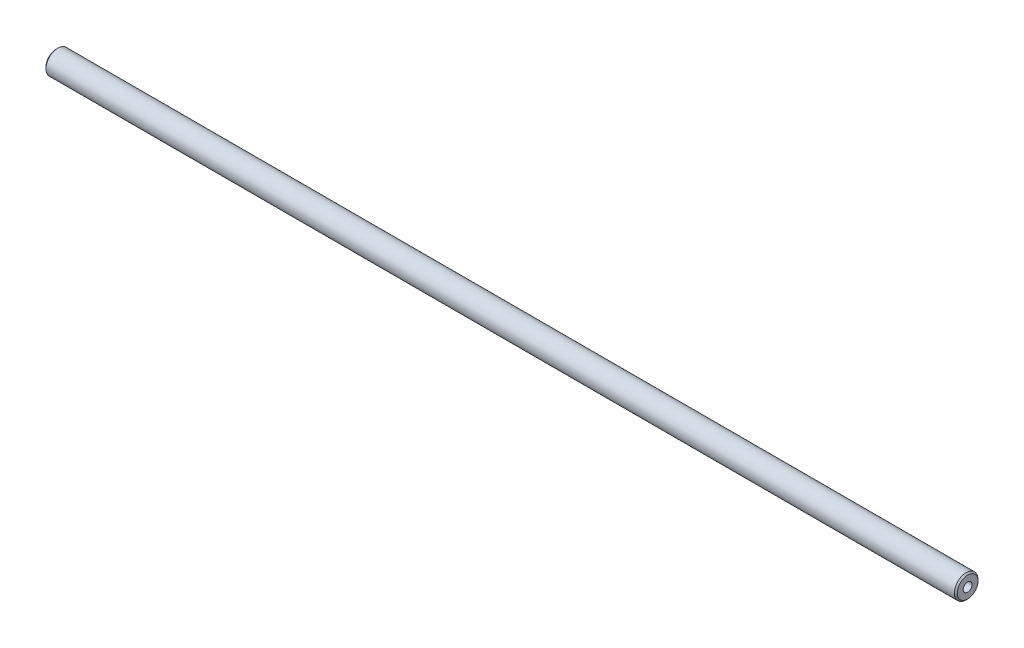
ISO-10303-21;
HEADER;
FILE_DESCRIPTION(('STEP AP214'),'2;1');
FILE_NAME('part.step','',(''),(''),'','','');
FILE_SCHEMA(('AUTOMOTIVE_DESIGN { 1 0 10303 214 1 1 1 1 }'));
ENDSEC;
DATA;
#1=APPLICATION_CONTEXT('core data for automotive mechanical design processes');
#2=APPLICATION_PROTOCOL_DEFINITION('international standard','automotive_design',2000,#1);
#3=PRODUCT_CONTEXT('',#1,'mechanical');
#4=PRODUCT('Part','Part','',(#3));
#5=PRODUCT_RELATED_PRODUCT_CATEGORY('part','',(#4));
#6=PRODUCT_DEFINITION_FORMATION('','',#4);
#7=PRODUCT_DEFINITION_CONTEXT('part definition',#1,'design');
#8=PRODUCT_DEFINITION('design','',#6,#7);
#9=PRODUCT_DEFINITION_SHAPE('','',#8);
#10=(LENGTH_UNIT() NAMED_UNIT(*) SI_UNIT(.MILLI.,.METRE.));
#11=(NAMED_UNIT(*) PLANE_ANGLE_UNIT() SI_UNIT($,.RADIAN.));
#12=(NAMED_UNIT(*) SI_UNIT($,.STERADIAN.) SOLID_ANGLE_UNIT());
#13=UNCERTAINTY_MEASURE_WITH_UNIT(LENGTH_MEASURE(1.E-05),#10,'distance_accuracy_value','');
#14=(GEOMETRIC_REPRESENTATION_CONTEXT(3) GLOBAL_UNCERTAINTY_ASSIGNED_CONTEXT((#13)) GLOBAL_UNIT_ASSIGNED_CONTEXT((#10,
#11,#12)) REPRESENTATION_CONTEXT('',''));
#15=CARTESIAN_POINT('',(0.,0.,0.));
#16=DIRECTION('',(0.,0.,1.));
#17=DIRECTION('',(1.,0.,0.));
#18=AXIS2_PLACEMENT_3D('',#15,#16,#17);
#19=CARTESIAN_POINT('',(-154.,0.,0.));
#20=DIRECTION('',(1.,0.,0.));
#21=DIRECTION('',(0.,0.,-1.));
#22=AXIS2_PLACEMENT_3D('',#19,#20,#21);
#23=CYLINDRICAL_SURFACE('',#22,1.5);
#24=CARTESIAN_POINT('',(-146.,0.,0.));
#25=DIRECTION('',(1.,0.,0.));
#26=DIRECTION('',(0.,0.,-1.));
#27=AXIS2_PLACEMENT_3D('',#24,#25,#26);
#28=CIRCLE('',#27,1.5);
#29=CARTESIAN_POINT('',(-146.,0.,-1.5));
#30=VERTEX_POINT('',#29);
#31=EDGE_CURVE('E63',#30,#30,#28,.T.);
#32=ORIENTED_EDGE('',*,*,#31,.T.);
#33=EDGE_LOOP('',(#32));
#34=FACE_BOUND('',#33,.T.);
#35=CARTESIAN_POINT('',(-154.,0.,0.));
#36=DIRECTION('',(1.,0.,0.));
#37=DIRECTION('',(0.,0.,-1.));
#38=AXIS2_PLACEMENT_3D('',#35,#36,#37);
#39=CIRCLE('',#38,1.5);
#40=CARTESIAN_POINT('',(-154.,0.,-1.5));
#41=VERTEX_POINT('',#40);
#42=EDGE_CURVE('E10',#41,#41,#39,.T.);
#43=ORIENTED_EDGE('',*,*,#42,.F.);
#44=EDGE_LOOP('',(#43));
#45=FACE_BOUND('',#44,.T.);
#46=ADVANCED_FACE('F35',(#34,#45),#23,.F.);
#47=CARTESIAN_POINT('',(-154.,3.5,0.));
#48=DIRECTION('',(-1.,0.,0.));
#49=DIRECTION('',(0.,0.,1.));
#50=AXIS2_PLACEMENT_3D('',#47,#48,#49);
#51=PLANE('',#50);
#52=ORIENTED_EDGE('',*,*,#42,.T.);
#53=EDGE_LOOP('',(#52));
#54=FACE_BOUND('',#53,.T.);
#55=CARTESIAN_POINT('',(-154.,0.,0.));
#56=DIRECTION('',(1.,0.,0.));
#57=DIRECTION('',(0.,0.,-1.));
#58=AXIS2_PLACEMENT_3D('',#55,#56,#57);
#59=CIRCLE('',#58,3.5);
#60=CARTESIAN_POINT('',(-154.,0.,-3.5));
#61=VERTEX_POINT('',#60);
#62=EDGE_CURVE('E41',#61,#61,#59,.T.);
#63=ORIENTED_EDGE('',*,*,#62,.F.);
#64=EDGE_LOOP('',(#63));
#65=FACE_BOUND('',#64,.T.);
#66=ADVANCED_FACE('F80',(#54,#65),#51,.T.);
#67=CARTESIAN_POINT('',(-153.5,0.,0.));
#68=DIRECTION('',(1.,0.,0.));
#69=DIRECTION('',(0.,0.,-1.));
#70=AXIS2_PLACEMENT_3D('',#67,#68,#69);
#71=CONICAL_SURFACE('',#70,4.,0.785398163397445);
#72=ORIENTED_EDGE('',*,*,#62,.T.);
#73=EDGE_LOOP('',(#72));
#74=FACE_BOUND('',#73,.T.);
#75=CARTESIAN_POINT('',(-153.5,0.,0.));
#76=DIRECTION('',(1.,0.,0.));
#77=DIRECTION('',(0.,0.,-1.));
#78=AXIS2_PLACEMENT_3D('',#75,#76,#77);
#79=CIRCLE('',#78,4.);
#80=CARTESIAN_POINT('',(-153.5,0.,-4.));
#81=VERTEX_POINT('',#80);
#82=EDGE_CURVE('E45',#81,#81,#79,.T.);
#83=ORIENTED_EDGE('',*,*,#82,.F.);
#84=EDGE_LOOP('',(#83));
#85=FACE_BOUND('',#84,.T.);
#86=ADVANCED_FACE('F84',(#74,#85),#71,.T.);
#87=CARTESIAN_POINT('',(-154.,0.,0.));
#88=DIRECTION('',(1.,0.,0.));
#89=DIRECTION('',(0.,0.,-1.));
#90=AXIS2_PLACEMENT_3D('',#87,#88,#89);
#91=CYLINDRICAL_SURFACE('',#90,4.);
#92=ORIENTED_EDGE('',*,*,#82,.T.);
#93=EDGE_LOOP('',(#92));
#94=FACE_BOUND('',#93,.T.);
#95=CARTESIAN_POINT('',(153.5,0.,0.));
#96=DIRECTION('',(1.,0.,0.));
#97=DIRECTION('',(0.,0.,-1.));
#98=AXIS2_PLACEMENT_3D('',#95,#96,#97);
#99=CIRCLE('',#98,4.);
#100=CARTESIAN_POINT('',(153.5,0.,-4.));
#101=VERTEX_POINT('',#100);
#102=EDGE_CURVE('E49',#101,#101,#99,.T.);
#103=ORIENTED_EDGE('',*,*,#102,.F.);
#104=EDGE_LOOP('',(#103));
#105=FACE_BOUND('',#104,.T.);
#106=ADVANCED_FACE('F88',(#94,#105),#91,.T.);
#107=CARTESIAN_POINT('',(154.,0.,0.));
#108=DIRECTION('',(-1.,0.,0.));
#109=DIRECTION('',(0.,0.,1.));
#110=AXIS2_PLACEMENT_3D('',#107,#108,#109);
#111=CONICAL_SURFACE('',#110,3.5,0.785398163397446);
#112=ORIENTED_EDGE('',*,*,#102,.T.);
#113=EDGE_LOOP('',(#112));
#114=FACE_BOUND('',#113,.T.);
#115=CARTESIAN_POINT('',(154.,0.,0.));
#116=DIRECTION('',(1.,0.,0.));
#117=DIRECTION('',(0.,0.,-1.));
#118=AXIS2_PLACEMENT_3D('',#115,#116,#117);
#119=CIRCLE('',#118,3.5);
#120=CARTESIAN_POINT('',(154.,0.,-3.5));
#121=VERTEX_POINT('',#120);
#122=EDGE_CURVE('E54',#121,#121,#119,.T.);
#123=ORIENTED_EDGE('',*,*,#122,.F.);
#124=EDGE_LOOP('',(#123));
#125=FACE_BOUND('',#124,.T.);
#126=ADVANCED_FACE('F94',(#114,#125),#111,.T.);
#127=CARTESIAN_POINT('',(154.,1.5,0.));
#128=DIRECTION('',(1.,0.,0.));
#129=DIRECTION('',(0.,0.,-1.));
#130=AXIS2_PLACEMENT_3D('',#127,#128,#129);
#131=PLANE('',#130);
#132=ORIENTED_EDGE('',*,*,#122,.T.);
#133=EDGE_LOOP('',(#132));
#134=FACE_BOUND('',#133,.T.);
#135=CARTESIAN_POINT('',(154.,0.,0.));
#136=DIRECTION('',(1.,0.,0.));
#137=DIRECTION('',(0.,0.,-1.));
#138=AXIS2_PLACEMENT_3D('',#135,#136,#137);
#139=CIRCLE('',#138,1.5);
#140=CARTESIAN_POINT('',(154.,0.,-1.5));
#141=VERTEX_POINT('',#140);
#142=EDGE_CURVE('E57',#141,#141,#139,.T.);
#143=ORIENTED_EDGE('',*,*,#142,.F.);
#144=EDGE_LOOP('',(#143));
#145=FACE_BOUND('',#144,.T.);
#146=ADVANCED_FACE('F98',(#134,#145),#131,.T.);
#147=CARTESIAN_POINT('',(-154.,0.,0.));
#148=DIRECTION('',(1.,0.,0.));
#149=DIRECTION('',(0.,0.,-1.));
#150=AXIS2_PLACEMENT_3D('',#147,#148,#149);
#151=CYLINDRICAL_SURFACE('',#150,1.5);
#152=ORIENTED_EDGE('',*,*,#142,.T.);
#153=EDGE_LOOP('',(#152));
#154=FACE_BOUND('',#153,.T.);
#155=CARTESIAN_POINT('',(146.,0.,0.));
#156=DIRECTION('',(1.,0.,0.));
#157=DIRECTION('',(0.,0.,-1.));
#158=AXIS2_PLACEMENT_3D('',#155,#156,#157);
#159=CIRCLE('',#158,1.5);
#160=CARTESIAN_POINT('',(146.,0.,-1.5));
#161=VERTEX_POINT('',#160);
#162=EDGE_CURVE('E60',#161,#161,#159,.T.);
#163=ORIENTED_EDGE('',*,*,#162,.F.);
#164=EDGE_LOOP('',(#163));
#165=FACE_BOUND('',#164,.T.);
#166=ADVANCED_FACE('F76',(#154,#165),#151,.F.);
#167=CARTESIAN_POINT('',(146.,0.,0.));
#168=DIRECTION('',(1.,0.,0.));
#169=DIRECTION('',(0.,0.,-1.));
#170=AXIS2_PLACEMENT_3D('',#167,#168,#169);
#171=PLANE('',#170);
#172=ORIENTED_EDGE('',*,*,#162,.T.);
#173=EDGE_LOOP('',(#172));
#174=FACE_BOUND('',#173,.T.);
#175=ADVANCED_FACE('F71',(#174),#171,.T.);
#176=CARTESIAN_POINT('',(-146.,1.5,0.));
#177=DIRECTION('',(-1.,0.,0.));
#178=DIRECTION('',(0.,0.,1.));
#179=AXIS2_PLACEMENT_3D('',#176,#177,#178);
#180=PLANE('',#179);
#181=ORIENTED_EDGE('',*,*,#31,.F.);
#182=EDGE_LOOP('',(#181));
#183=FACE_BOUND('',#182,.T.);
#184=ADVANCED_FACE('F69',(#183),#180,.T.);
#185=CLOSED_SHELL('',(#46,#66,#86,#106,#126,#146,#166,#175,#184));
#186=MANIFOLD_SOLID_BREP('B2',#185);
#187=ADVANCED_BREP_SHAPE_REPRESENTATION('',(#18,#186),#14);
#188=SHAPE_DEFINITION_REPRESENTATION(#9,#187);
ENDSEC;
END-ISO-10303-21;
